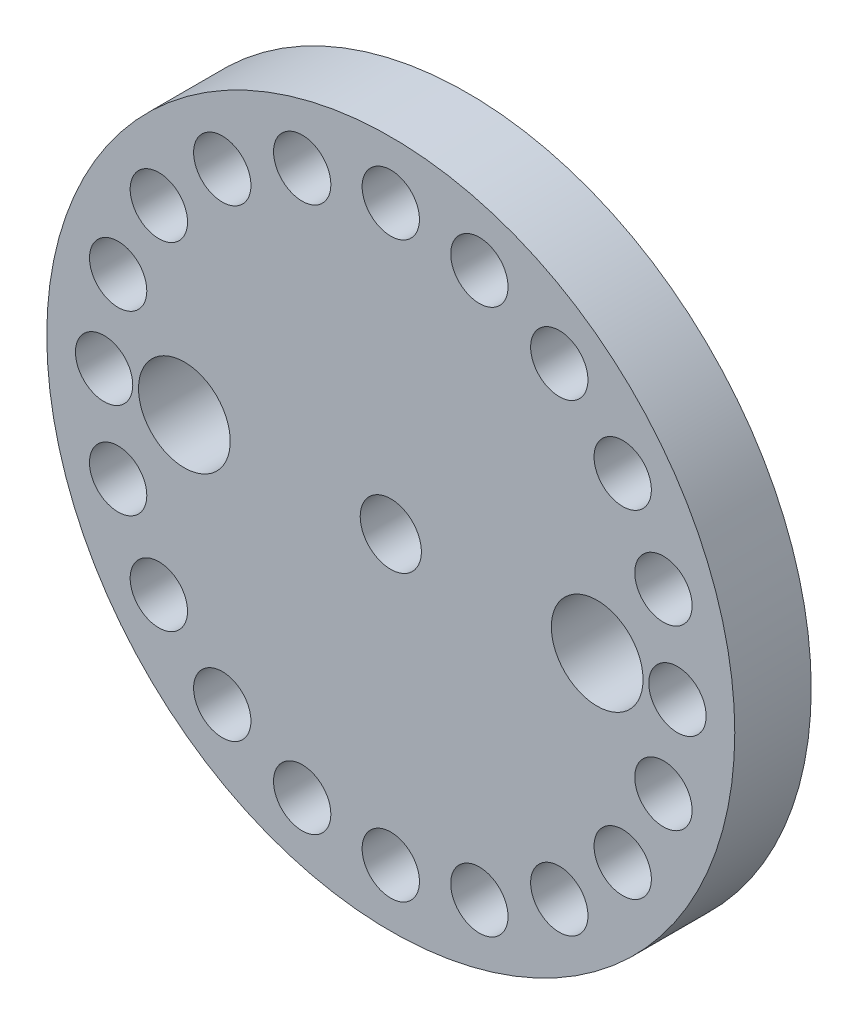
ISO-10303-21;
HEADER;
FILE_DESCRIPTION(('STEP AP214'),'2;1');
FILE_NAME('part.step','',(''),(''),'','','');
FILE_SCHEMA(('AUTOMOTIVE_DESIGN { 1 0 10303 214 1 1 1 1 }'));
ENDSEC;
DATA;
#1=APPLICATION_CONTEXT('core data for automotive mechanical design processes');
#2=APPLICATION_PROTOCOL_DEFINITION('international standard','automotive_design',2000,#1);
#3=PRODUCT_CONTEXT('',#1,'mechanical');
#4=PRODUCT('Part','Part','',(#3));
#5=PRODUCT_RELATED_PRODUCT_CATEGORY('part','',(#4));
#6=PRODUCT_DEFINITION_FORMATION('','',#4);
#7=PRODUCT_DEFINITION_CONTEXT('part definition',#1,'design');
#8=PRODUCT_DEFINITION('design','',#6,#7);
#9=PRODUCT_DEFINITION_SHAPE('','',#8);
#10=(LENGTH_UNIT() NAMED_UNIT(*) SI_UNIT(.MILLI.,.METRE.));
#11=(NAMED_UNIT(*) PLANE_ANGLE_UNIT() SI_UNIT($,.RADIAN.));
#12=(NAMED_UNIT(*) SI_UNIT($,.STERADIAN.) SOLID_ANGLE_UNIT());
#13=UNCERTAINTY_MEASURE_WITH_UNIT(LENGTH_MEASURE(1.E-05),#10,'distance_accuracy_value','');
#14=(GEOMETRIC_REPRESENTATION_CONTEXT(3) GLOBAL_UNCERTAINTY_ASSIGNED_CONTEXT((#13)) GLOBAL_UNIT_ASSIGNED_CONTEXT((#10,
#11,#12)) REPRESENTATION_CONTEXT('',''));
#15=CARTESIAN_POINT('',(0.,0.,0.));
#16=DIRECTION('',(0.,0.,1.));
#17=DIRECTION('',(1.,0.,0.));
#18=AXIS2_PLACEMENT_3D('',#15,#16,#17);
#19=CARTESIAN_POINT('',(0.,0.,10.));
#20=DIRECTION('',(0.,0.,1.));
#21=DIRECTION('',(1.,0.,0.));
#22=AXIS2_PLACEMENT_3D('',#19,#20,#21);
#23=PLANE('',#22);
#24=CARTESIAN_POINT('',(0.,0.,10.));
#25=DIRECTION('',(0.,0.,1.));
#26=DIRECTION('',(1.,0.,0.));
#27=AXIS2_PLACEMENT_3D('',#24,#25,#26);
#28=CIRCLE('',#27,4.);
#29=CARTESIAN_POINT('',(-4.,0.,10.));
#30=VERTEX_POINT('',#29);
#31=EDGE_CURVE('E173',#30,#30,#28,.T.);
#32=ORIENTED_EDGE('',*,*,#31,.F.);
#33=EDGE_LOOP('',(#32));
#34=FACE_BOUND('',#33,.T.);
#35=CARTESIAN_POINT('',(-27.,0.,10.));
#36=DIRECTION('',(0.,0.,-1.));
#37=DIRECTION('',(-1.,0.,0.));
#38=AXIS2_PLACEMENT_3D('',#35,#36,#37);
#39=CIRCLE('',#38,6.);
#40=CARTESIAN_POINT('',(-33.,0.,10.));
#41=VERTEX_POINT('',#40);
#42=EDGE_CURVE('E166',#41,#41,#39,.T.);
#43=ORIENTED_EDGE('',*,*,#42,.T.);
#44=EDGE_LOOP('',(#43));
#45=FACE_BOUND('',#44,.T.);
#46=CARTESIAN_POINT('',(27.,0.,10.));
#47=DIRECTION('',(0.,0.,-1.));
#48=DIRECTION('',(1.,0.,0.));
#49=AXIS2_PLACEMENT_3D('',#46,#47,#48);
#50=CIRCLE('',#49,6.);
#51=CARTESIAN_POINT('',(33.,0.,10.));
#52=VERTEX_POINT('',#51);
#53=EDGE_CURVE('E172',#52,#52,#50,.T.);
#54=ORIENTED_EDGE('',*,*,#53,.T.);
#55=EDGE_LOOP('',(#54));
#56=FACE_BOUND('',#55,.T.);
#57=CARTESIAN_POINT('',(-22.0419469609674,30.3381372890596,10.));
#58=DIRECTION('',(0.,0.,1.));
#59=DIRECTION('',(1.,0.,0.));
#60=AXIS2_PLACEMENT_3D('',#57,#58,#59);
#61=CIRCLE('',#60,3.75000000000104);
#62=CARTESIAN_POINT('',(-18.2919469609664,30.3381372890596,10.));
#63=VERTEX_POINT('',#62);
#64=EDGE_CURVE('E154',#63,#63,#61,.T.);
#65=ORIENTED_EDGE('',*,*,#64,.F.);
#66=EDGE_LOOP('',(#65));
#67=FACE_BOUND('',#66,.T.);
#68=CARTESIAN_POINT('',(-35.6646193610672,11.588137289059,10.));
#69=DIRECTION('',(0.,0.,1.));
#70=DIRECTION('',(1.,0.,0.));
#71=AXIS2_PLACEMENT_3D('',#68,#69,#70);
#72=CIRCLE('',#71,3.75000000000191);
#73=CARTESIAN_POINT('',(-31.9146193610653,11.588137289059,10.));
#74=VERTEX_POINT('',#73);
#75=EDGE_CURVE('E142',#74,#74,#72,.T.);
#76=ORIENTED_EDGE('',*,*,#75,.F.);
#77=EDGE_LOOP('',(#76));
#78=FACE_BOUND('',#77,.T.);
#79=CARTESIAN_POINT('',(-35.6646193610662,-11.588137289062,10.));
#80=DIRECTION('',(0.,0.,1.));
#81=DIRECTION('',(1.,0.,0.));
#82=AXIS2_PLACEMENT_3D('',#79,#80,#81);
#83=CIRCLE('',#82,3.75000000000279);
#84=CARTESIAN_POINT('',(-31.9146193610634,-11.588137289062,10.));
#85=VERTEX_POINT('',#84);
#86=EDGE_CURVE('E130',#85,#85,#83,.T.);
#87=ORIENTED_EDGE('',*,*,#86,.F.);
#88=EDGE_LOOP('',(#87));
#89=FACE_BOUND('',#88,.T.);
#90=CARTESIAN_POINT('',(-22.0419469609649,-30.3381372890615,10.));
#91=DIRECTION('',(0.,0.,1.));
#92=DIRECTION('',(1.,0.,0.));
#93=AXIS2_PLACEMENT_3D('',#90,#91,#92);
#94=CIRCLE('',#93,3.75000000000334);
#95=CARTESIAN_POINT('',(-18.2919469609615,-30.3381372890615,10.));
#96=VERTEX_POINT('',#95);
#97=EDGE_CURVE('E118',#96,#96,#94,.T.);
#98=ORIENTED_EDGE('',*,*,#97,.F.);
#99=EDGE_LOOP('',(#98));
#100=FACE_BOUND('',#99,.T.);
#101=CARTESIAN_POINT('',(3.18366503443004E-12,-37.5,10.));
#102=DIRECTION('',(0.,0.,1.));
#103=DIRECTION('',(1.,0.,0.));
#104=AXIS2_PLACEMENT_3D('',#101,#102,#103);
#105=CIRCLE('',#104,3.7500000000033);
#106=CARTESIAN_POINT('',(3.75000000000648,-37.5,10.));
#107=VERTEX_POINT('',#106);
#108=EDGE_CURVE('E106',#107,#107,#105,.T.);
#109=ORIENTED_EDGE('',*,*,#108,.F.);
#110=EDGE_LOOP('',(#109));
#111=FACE_BOUND('',#110,.T.);
#112=CARTESIAN_POINT('',(22.0419469609706,-30.3381372890596,10.));
#113=DIRECTION('',(0.,0.,1.));
#114=DIRECTION('',(1.,0.,0.));
#115=AXIS2_PLACEMENT_3D('',#112,#113,#114);
#116=CIRCLE('',#115,3.75000000000269);
#117=CARTESIAN_POINT('',(25.7919469609733,-30.3381372890596,10.));
#118=VERTEX_POINT('',#117);
#119=EDGE_CURVE('E94',#118,#118,#116,.T.);
#120=ORIENTED_EDGE('',*,*,#119,.F.);
#121=EDGE_LOOP('',(#120));
#122=FACE_BOUND('',#121,.T.);
#123=CARTESIAN_POINT('',(35.6646193610703,-11.588137289059,10.));
#124=DIRECTION('',(0.,0.,1.));
#125=DIRECTION('',(1.,0.,0.));
#126=AXIS2_PLACEMENT_3D('',#123,#124,#125);
#127=CIRCLE('',#126,3.75000000000171);
#128=CARTESIAN_POINT('',(39.414619361072,-11.588137289059,10.));
#129=VERTEX_POINT('',#128);
#130=EDGE_CURVE('E82',#129,#129,#127,.T.);
#131=ORIENTED_EDGE('',*,*,#130,.F.);
#132=EDGE_LOOP('',(#131));
#133=FACE_BOUND('',#132,.T.);
#134=CARTESIAN_POINT('',(35.6646193610694,11.588137289062,10.));
#135=DIRECTION('',(0.,0.,1.));
#136=DIRECTION('',(1.,0.,0.));
#137=AXIS2_PLACEMENT_3D('',#134,#135,#136);
#138=CIRCLE('',#137,3.75000000000072);
#139=CARTESIAN_POINT('',(39.4146193610701,11.588137289062,10.));
#140=VERTEX_POINT('',#139);
#141=EDGE_CURVE('E70',#140,#140,#138,.T.);
#142=ORIENTED_EDGE('',*,*,#141,.F.);
#143=EDGE_LOOP('',(#142));
#144=FACE_BOUND('',#143,.T.);
#145=CARTESIAN_POINT('',(22.0419469609678,30.3381372890605,10.));
#146=DIRECTION('',(0.,0.,1.));
#147=DIRECTION('',(1.,0.,0.));
#148=AXIS2_PLACEMENT_3D('',#145,#146,#147);
#149=CIRCLE('',#148,3.75);
#150=CARTESIAN_POINT('',(25.7919469609678,30.3381372890605,10.));
#151=VERTEX_POINT('',#150);
#152=EDGE_CURVE('E58',#151,#151,#149,.T.);
#153=ORIENTED_EDGE('',*,*,#152,.F.);
#154=EDGE_LOOP('',(#153));
#155=FACE_BOUND('',#154,.T.);
#156=CARTESIAN_POINT('',(0.,37.5,10.));
#157=DIRECTION('',(0.,0.,1.));
#158=DIRECTION('',(1.,0.,0.));
#159=AXIS2_PLACEMENT_3D('',#156,#157,#158);
#160=CIRCLE('',#159,3.75);
#161=CARTESIAN_POINT('',(3.75,37.5,10.));
#162=VERTEX_POINT('',#161);
#163=EDGE_CURVE('E47',#162,#162,#160,.T.);
#164=ORIENTED_EDGE('',*,*,#163,.F.);
#165=EDGE_LOOP('',(#164));
#166=FACE_BOUND('',#165,.T.);
#167=CARTESIAN_POINT('',(0.,0.,10.));
#168=DIRECTION('',(0.,0.,1.));
#169=DIRECTION('',(1.,0.,0.));
#170=AXIS2_PLACEMENT_3D('',#167,#168,#169);
#171=CIRCLE('',#170,45.);
#172=CARTESIAN_POINT('',(45.,0.,10.));
#173=VERTEX_POINT('',#172);
#174=EDGE_CURVE('E10',#173,#173,#171,.T.);
#175=ORIENTED_EDGE('',*,*,#174,.T.);
#176=EDGE_LOOP('',(#175));
#177=FACE_BOUND('',#176,.T.);
#178=CARTESIAN_POINT('',(11.5881372890606,35.6646193610683,10.));
#179=DIRECTION('',(0.,0.,1.));
#180=DIRECTION('',(1.,0.,0.));
#181=AXIS2_PLACEMENT_3D('',#178,#179,#180);
#182=CIRCLE('',#181,3.75);
#183=CARTESIAN_POINT('',(15.3381372890606,35.6646193610683,10.));
#184=VERTEX_POINT('',#183);
#185=EDGE_CURVE('E52',#184,#184,#182,.T.);
#186=ORIENTED_EDGE('',*,*,#185,.F.);
#187=EDGE_LOOP('',(#186));
#188=FACE_BOUND('',#187,.T.);
#189=CARTESIAN_POINT('',(30.3381372890612,22.041946960969,10.));
#190=DIRECTION('',(0.,0.,1.));
#191=DIRECTION('',(1.,0.,0.));
#192=AXIS2_PLACEMENT_3D('',#189,#190,#191);
#193=CIRCLE('',#192,3.75000000000033);
#194=CARTESIAN_POINT('',(34.0881372890615,22.041946960969,10.));
#195=VERTEX_POINT('',#194);
#196=EDGE_CURVE('E64',#195,#195,#193,.T.);
#197=ORIENTED_EDGE('',*,*,#196,.F.);
#198=EDGE_LOOP('',(#197));
#199=FACE_BOUND('',#198,.T.);
#200=CARTESIAN_POINT('',(37.5000000000016,1.59183251721502E-12,10.));
#201=DIRECTION('',(0.,0.,1.));
#202=DIRECTION('',(1.,0.,0.));
#203=AXIS2_PLACEMENT_3D('',#200,#201,#202);
#204=CIRCLE('',#203,3.75000000000119);
#205=CARTESIAN_POINT('',(41.2500000000028,1.59183251721502E-12,10.));
#206=VERTEX_POINT('',#205);
#207=EDGE_CURVE('E76',#206,#206,#204,.T.);
#208=ORIENTED_EDGE('',*,*,#207,.F.);
#209=EDGE_LOOP('',(#208));
#210=FACE_BOUND('',#209,.T.);
#211=CARTESIAN_POINT('',(30.3381372890631,-22.0419469609665,10.));
#212=DIRECTION('',(0.,0.,1.));
#213=DIRECTION('',(1.,0.,0.));
#214=AXIS2_PLACEMENT_3D('',#211,#212,#213);
#215=CIRCLE('',#214,3.75000000000222);
#216=CARTESIAN_POINT('',(34.0881372890653,-22.0419469609665,10.));
#217=VERTEX_POINT('',#216);
#218=EDGE_CURVE('E88',#217,#217,#215,.T.);
#219=ORIENTED_EDGE('',*,*,#218,.F.);
#220=EDGE_LOOP('',(#219));
#221=FACE_BOUND('',#220,.T.);
#222=CARTESIAN_POINT('',(11.5881372890636,-35.6646193610678,10.));
#223=DIRECTION('',(0.,0.,1.));
#224=DIRECTION('',(1.,0.,0.));
#225=AXIS2_PLACEMENT_3D('',#222,#223,#224);
#226=CIRCLE('',#225,3.75000000000307);
#227=CARTESIAN_POINT('',(15.3381372890667,-35.6646193610678,10.));
#228=VERTEX_POINT('',#227);
#229=EDGE_CURVE('E100',#228,#228,#226,.T.);
#230=ORIENTED_EDGE('',*,*,#229,.F.);
#231=EDGE_LOOP('',(#230));
#232=FACE_BOUND('',#231,.T.);
#233=CARTESIAN_POINT('',(-11.5881372890574,-35.6646193610688,10.));
#234=DIRECTION('',(0.,0.,1.));
#235=DIRECTION('',(1.,0.,0.));
#236=AXIS2_PLACEMENT_3D('',#233,#234,#235);
#237=CIRCLE('',#236,3.7500000000034);
#238=CARTESIAN_POINT('',(-7.83813728905402,-35.6646193610688,10.));
#239=VERTEX_POINT('',#238);
#240=EDGE_CURVE('E112',#239,#239,#237,.T.);
#241=ORIENTED_EDGE('',*,*,#240,.F.);
#242=EDGE_LOOP('',(#241));
#243=FACE_BOUND('',#242,.T.);
#244=CARTESIAN_POINT('',(-30.338137289058,-22.041946960969,10.));
#245=DIRECTION('',(0.,0.,1.));
#246=DIRECTION('',(1.,0.,0.));
#247=AXIS2_PLACEMENT_3D('',#244,#245,#246);
#248=CIRCLE('',#247,3.75000000000315);
#249=CARTESIAN_POINT('',(-26.5881372890549,-22.041946960969,10.));
#250=VERTEX_POINT('',#249);
#251=EDGE_CURVE('E124',#250,#250,#248,.T.);
#252=ORIENTED_EDGE('',*,*,#251,.F.);
#253=EDGE_LOOP('',(#252));
#254=FACE_BOUND('',#253,.T.);
#255=CARTESIAN_POINT('',(-37.4999999999984,-1.59642494271182E-12,10.));
#256=DIRECTION('',(0.,0.,1.));
#257=DIRECTION('',(1.,0.,0.));
#258=AXIS2_PLACEMENT_3D('',#255,#256,#257);
#259=CIRCLE('',#258,3.75000000000237);
#260=CARTESIAN_POINT('',(-33.749999999996,-1.59642494271182E-12,10.));
#261=VERTEX_POINT('',#260);
#262=EDGE_CURVE('E136',#261,#261,#259,.T.);
#263=ORIENTED_EDGE('',*,*,#262,.F.);
#264=EDGE_LOOP('',(#263));
#265=FACE_BOUND('',#264,.T.);
#266=CARTESIAN_POINT('',(-30.3381372890599,22.0419469609664,10.));
#267=DIRECTION('',(0.,0.,1.));
#268=DIRECTION('',(1.,0.,0.));
#269=AXIS2_PLACEMENT_3D('',#266,#267,#268);
#270=CIRCLE('',#269,3.75000000000145);
#271=CARTESIAN_POINT('',(-26.5881372890584,22.0419469609664,10.));
#272=VERTEX_POINT('',#271);
#273=EDGE_CURVE('E148',#272,#272,#270,.T.);
#274=ORIENTED_EDGE('',*,*,#273,.F.);
#275=EDGE_LOOP('',(#274));
#276=FACE_BOUND('',#275,.T.);
#277=CARTESIAN_POINT('',(-11.5881372890601,35.6646193610684,10.));
#278=DIRECTION('',(0.,0.,1.));
#279=DIRECTION('',(1.,0.,0.));
#280=AXIS2_PLACEMENT_3D('',#277,#278,#279);
#281=CIRCLE('',#280,3.75);
#282=CARTESIAN_POINT('',(-7.83813728906006,35.6646193610684,10.));
#283=VERTEX_POINT('',#282);
#284=EDGE_CURVE('E160',#283,#283,#281,.T.);
#285=ORIENTED_EDGE('',*,*,#284,.F.);
#286=EDGE_LOOP('',(#285));
#287=FACE_BOUND('',#286,.T.);
#288=ADVANCED_FACE('F36',(#34,#45,#56,#67,#78,#89,#100,#111,#122,#133,#144,#155,#166,#177,#188,
#199,#210,#221,#232,#243,#254,#265,#276,#287),#23,.T.);
#289=CARTESIAN_POINT('',(0.,0.,0.));
#290=DIRECTION('',(0.,0.,1.));
#291=DIRECTION('',(1.,0.,0.));
#292=AXIS2_PLACEMENT_3D('',#289,#290,#291);
#293=PLANE('',#292);
#294=CARTESIAN_POINT('',(0.,0.,0.));
#295=DIRECTION('',(0.,0.,-1.));
#296=DIRECTION('',(-1.,0.,0.));
#297=AXIS2_PLACEMENT_3D('',#294,#295,#296);
#298=CIRCLE('',#297,4.);
#299=CARTESIAN_POINT('',(-4.,0.,0.));
#300=VERTEX_POINT('',#299);
#301=EDGE_CURVE('E183',#300,#300,#298,.T.);
#302=ORIENTED_EDGE('',*,*,#301,.F.);
#303=EDGE_LOOP('',(#302));
#304=FACE_BOUND('',#303,.T.);
#305=CARTESIAN_POINT('',(-27.,0.,0.));
#306=DIRECTION('',(0.,0.,-1.));
#307=DIRECTION('',(-1.,0.,0.));
#308=AXIS2_PLACEMENT_3D('',#305,#306,#307);
#309=CIRCLE('',#308,6.);
#310=CARTESIAN_POINT('',(-33.,0.,0.));
#311=VERTEX_POINT('',#310);
#312=EDGE_CURVE('E176',#311,#311,#309,.T.);
#313=ORIENTED_EDGE('',*,*,#312,.F.);
#314=EDGE_LOOP('',(#313));
#315=FACE_BOUND('',#314,.T.);
#316=CARTESIAN_POINT('',(27.,0.,0.));
#317=DIRECTION('',(0.,0.,-1.));
#318=DIRECTION('',(1.,0.,0.));
#319=AXIS2_PLACEMENT_3D('',#316,#317,#318);
#320=CIRCLE('',#319,6.);
#321=CARTESIAN_POINT('',(33.,0.,0.));
#322=VERTEX_POINT('',#321);
#323=EDGE_CURVE('E169',#322,#322,#320,.T.);
#324=ORIENTED_EDGE('',*,*,#323,.F.);
#325=EDGE_LOOP('',(#324));
#326=FACE_BOUND('',#325,.T.);
#327=CARTESIAN_POINT('',(0.,0.,0.));
#328=DIRECTION('',(0.,0.,1.));
#329=DIRECTION('',(1.,0.,0.));
#330=AXIS2_PLACEMENT_3D('',#327,#328,#329);
#331=CIRCLE('',#330,45.);
#332=CARTESIAN_POINT('',(45.,0.,0.));
#333=VERTEX_POINT('',#332);
#334=EDGE_CURVE('E40',#333,#333,#331,.T.);
#335=ORIENTED_EDGE('',*,*,#334,.F.);
#336=EDGE_LOOP('',(#335));
#337=FACE_BOUND('',#336,.T.);
#338=CARTESIAN_POINT('',(0.,37.5,0.));
#339=DIRECTION('',(0.,0.,1.));
#340=DIRECTION('',(1.,0.,0.));
#341=AXIS2_PLACEMENT_3D('',#338,#339,#340);
#342=CIRCLE('',#341,3.75);
#343=CARTESIAN_POINT('',(3.75,37.5,0.));
#344=VERTEX_POINT('',#343);
#345=EDGE_CURVE('E49',#344,#344,#342,.T.);
#346=ORIENTED_EDGE('',*,*,#345,.T.);
#347=EDGE_LOOP('',(#346));
#348=FACE_BOUND('',#347,.T.);
#349=CARTESIAN_POINT('',(11.5881372890606,35.6646193610683,0.));
#350=DIRECTION('',(0.,0.,1.));
#351=DIRECTION('',(1.,0.,0.));
#352=AXIS2_PLACEMENT_3D('',#349,#350,#351);
#353=CIRCLE('',#352,3.75);
#354=CARTESIAN_POINT('',(15.3381372890606,35.6646193610683,0.));
#355=VERTEX_POINT('',#354);
#356=EDGE_CURVE('E55',#355,#355,#353,.T.);
#357=ORIENTED_EDGE('',*,*,#356,.T.);
#358=EDGE_LOOP('',(#357));
#359=FACE_BOUND('',#358,.T.);
#360=CARTESIAN_POINT('',(22.0419469609678,30.3381372890605,0.));
#361=DIRECTION('',(0.,0.,1.));
#362=DIRECTION('',(1.,0.,0.));
#363=AXIS2_PLACEMENT_3D('',#360,#361,#362);
#364=CIRCLE('',#363,3.75);
#365=CARTESIAN_POINT('',(25.7919469609678,30.3381372890605,0.));
#366=VERTEX_POINT('',#365);
#367=EDGE_CURVE('E61',#366,#366,#364,.T.);
#368=ORIENTED_EDGE('',*,*,#367,.T.);
#369=EDGE_LOOP('',(#368));
#370=FACE_BOUND('',#369,.T.);
#371=CARTESIAN_POINT('',(30.3381372890612,22.041946960969,0.));
#372=DIRECTION('',(0.,0.,1.));
#373=DIRECTION('',(1.,0.,0.));
#374=AXIS2_PLACEMENT_3D('',#371,#372,#373);
#375=CIRCLE('',#374,3.75000000000033);
#376=CARTESIAN_POINT('',(34.0881372890615,22.041946960969,0.));
#377=VERTEX_POINT('',#376);
#378=EDGE_CURVE('E67',#377,#377,#375,.T.);
#379=ORIENTED_EDGE('',*,*,#378,.T.);
#380=EDGE_LOOP('',(#379));
#381=FACE_BOUND('',#380,.T.);
#382=CARTESIAN_POINT('',(35.6646193610694,11.588137289062,0.));
#383=DIRECTION('',(0.,0.,1.));
#384=DIRECTION('',(1.,0.,0.));
#385=AXIS2_PLACEMENT_3D('',#382,#383,#384);
#386=CIRCLE('',#385,3.75000000000072);
#387=CARTESIAN_POINT('',(39.4146193610701,11.588137289062,0.));
#388=VERTEX_POINT('',#387);
#389=EDGE_CURVE('E73',#388,#388,#386,.T.);
#390=ORIENTED_EDGE('',*,*,#389,.T.);
#391=EDGE_LOOP('',(#390));
#392=FACE_BOUND('',#391,.T.);
#393=CARTESIAN_POINT('',(37.5000000000016,1.59183251721502E-12,0.));
#394=DIRECTION('',(0.,0.,1.));
#395=DIRECTION('',(1.,0.,0.));
#396=AXIS2_PLACEMENT_3D('',#393,#394,#395);
#397=CIRCLE('',#396,3.75000000000119);
#398=CARTESIAN_POINT('',(41.2500000000028,1.59183251721502E-12,0.));
#399=VERTEX_POINT('',#398);
#400=EDGE_CURVE('E79',#399,#399,#397,.T.);
#401=ORIENTED_EDGE('',*,*,#400,.T.);
#402=EDGE_LOOP('',(#401));
#403=FACE_BOUND('',#402,.T.);
#404=CARTESIAN_POINT('',(35.6646193610703,-11.588137289059,0.));
#405=DIRECTION('',(0.,0.,1.));
#406=DIRECTION('',(1.,0.,0.));
#407=AXIS2_PLACEMENT_3D('',#404,#405,#406);
#408=CIRCLE('',#407,3.75000000000171);
#409=CARTESIAN_POINT('',(39.414619361072,-11.588137289059,0.));
#410=VERTEX_POINT('',#409);
#411=EDGE_CURVE('E85',#410,#410,#408,.T.);
#412=ORIENTED_EDGE('',*,*,#411,.T.);
#413=EDGE_LOOP('',(#412));
#414=FACE_BOUND('',#413,.T.);
#415=CARTESIAN_POINT('',(30.3381372890631,-22.0419469609665,0.));
#416=DIRECTION('',(0.,0.,1.));
#417=DIRECTION('',(1.,0.,0.));
#418=AXIS2_PLACEMENT_3D('',#415,#416,#417);
#419=CIRCLE('',#418,3.75000000000222);
#420=CARTESIAN_POINT('',(34.0881372890653,-22.0419469609665,0.));
#421=VERTEX_POINT('',#420);
#422=EDGE_CURVE('E91',#421,#421,#419,.T.);
#423=ORIENTED_EDGE('',*,*,#422,.T.);
#424=EDGE_LOOP('',(#423));
#425=FACE_BOUND('',#424,.T.);
#426=CARTESIAN_POINT('',(22.0419469609706,-30.3381372890596,0.));
#427=DIRECTION('',(0.,0.,1.));
#428=DIRECTION('',(1.,0.,0.));
#429=AXIS2_PLACEMENT_3D('',#426,#427,#428);
#430=CIRCLE('',#429,3.75000000000269);
#431=CARTESIAN_POINT('',(25.7919469609733,-30.3381372890596,0.));
#432=VERTEX_POINT('',#431);
#433=EDGE_CURVE('E97',#432,#432,#430,.T.);
#434=ORIENTED_EDGE('',*,*,#433,.T.);
#435=EDGE_LOOP('',(#434));
#436=FACE_BOUND('',#435,.T.);
#437=CARTESIAN_POINT('',(11.5881372890636,-35.6646193610678,0.));
#438=DIRECTION('',(0.,0.,1.));
#439=DIRECTION('',(1.,0.,0.));
#440=AXIS2_PLACEMENT_3D('',#437,#438,#439);
#441=CIRCLE('',#440,3.75000000000307);
#442=CARTESIAN_POINT('',(15.3381372890667,-35.6646193610678,0.));
#443=VERTEX_POINT('',#442);
#444=EDGE_CURVE('E103',#443,#443,#441,.T.);
#445=ORIENTED_EDGE('',*,*,#444,.T.);
#446=EDGE_LOOP('',(#445));
#447=FACE_BOUND('',#446,.T.);
#448=CARTESIAN_POINT('',(3.18366503443004E-12,-37.5,0.));
#449=DIRECTION('',(0.,0.,1.));
#450=DIRECTION('',(1.,0.,0.));
#451=AXIS2_PLACEMENT_3D('',#448,#449,#450);
#452=CIRCLE('',#451,3.7500000000033);
#453=CARTESIAN_POINT('',(3.75000000000648,-37.5,0.));
#454=VERTEX_POINT('',#453);
#455=EDGE_CURVE('E109',#454,#454,#452,.T.);
#456=ORIENTED_EDGE('',*,*,#455,.T.);
#457=EDGE_LOOP('',(#456));
#458=FACE_BOUND('',#457,.T.);
#459=CARTESIAN_POINT('',(-11.5881372890574,-35.6646193610688,0.));
#460=DIRECTION('',(0.,0.,1.));
#461=DIRECTION('',(1.,0.,0.));
#462=AXIS2_PLACEMENT_3D('',#459,#460,#461);
#463=CIRCLE('',#462,3.7500000000034);
#464=CARTESIAN_POINT('',(-7.83813728905402,-35.6646193610688,0.));
#465=VERTEX_POINT('',#464);
#466=EDGE_CURVE('E115',#465,#465,#463,.T.);
#467=ORIENTED_EDGE('',*,*,#466,.T.);
#468=EDGE_LOOP('',(#467));
#469=FACE_BOUND('',#468,.T.);
#470=CARTESIAN_POINT('',(-22.0419469609649,-30.3381372890615,0.));
#471=DIRECTION('',(0.,0.,1.));
#472=DIRECTION('',(1.,0.,0.));
#473=AXIS2_PLACEMENT_3D('',#470,#471,#472);
#474=CIRCLE('',#473,3.75000000000334);
#475=CARTESIAN_POINT('',(-18.2919469609615,-30.3381372890615,0.));
#476=VERTEX_POINT('',#475);
#477=EDGE_CURVE('E121',#476,#476,#474,.T.);
#478=ORIENTED_EDGE('',*,*,#477,.T.);
#479=EDGE_LOOP('',(#478));
#480=FACE_BOUND('',#479,.T.);
#481=CARTESIAN_POINT('',(-30.338137289058,-22.041946960969,0.));
#482=DIRECTION('',(0.,0.,1.));
#483=DIRECTION('',(1.,0.,0.));
#484=AXIS2_PLACEMENT_3D('',#481,#482,#483);
#485=CIRCLE('',#484,3.75000000000315);
#486=CARTESIAN_POINT('',(-26.5881372890549,-22.041946960969,0.));
#487=VERTEX_POINT('',#486);
#488=EDGE_CURVE('E127',#487,#487,#485,.T.);
#489=ORIENTED_EDGE('',*,*,#488,.T.);
#490=EDGE_LOOP('',(#489));
#491=FACE_BOUND('',#490,.T.);
#492=CARTESIAN_POINT('',(-35.6646193610662,-11.588137289062,0.));
#493=DIRECTION('',(0.,0.,1.));
#494=DIRECTION('',(1.,0.,0.));
#495=AXIS2_PLACEMENT_3D('',#492,#493,#494);
#496=CIRCLE('',#495,3.75000000000279);
#497=CARTESIAN_POINT('',(-31.9146193610634,-11.588137289062,0.));
#498=VERTEX_POINT('',#497);
#499=EDGE_CURVE('E133',#498,#498,#496,.T.);
#500=ORIENTED_EDGE('',*,*,#499,.T.);
#501=EDGE_LOOP('',(#500));
#502=FACE_BOUND('',#501,.T.);
#503=CARTESIAN_POINT('',(-37.4999999999984,-1.59642494271182E-12,0.));
#504=DIRECTION('',(0.,0.,1.));
#505=DIRECTION('',(1.,0.,0.));
#506=AXIS2_PLACEMENT_3D('',#503,#504,#505);
#507=CIRCLE('',#506,3.75000000000237);
#508=CARTESIAN_POINT('',(-33.749999999996,-1.59642494271182E-12,0.));
#509=VERTEX_POINT('',#508);
#510=EDGE_CURVE('E139',#509,#509,#507,.T.);
#511=ORIENTED_EDGE('',*,*,#510,.T.);
#512=EDGE_LOOP('',(#511));
#513=FACE_BOUND('',#512,.T.);
#514=CARTESIAN_POINT('',(-35.6646193610672,11.588137289059,0.));
#515=DIRECTION('',(0.,0.,1.));
#516=DIRECTION('',(1.,0.,0.));
#517=AXIS2_PLACEMENT_3D('',#514,#515,#516);
#518=CIRCLE('',#517,3.75000000000191);
#519=CARTESIAN_POINT('',(-31.9146193610653,11.588137289059,0.));
#520=VERTEX_POINT('',#519);
#521=EDGE_CURVE('E145',#520,#520,#518,.T.);
#522=ORIENTED_EDGE('',*,*,#521,.T.);
#523=EDGE_LOOP('',(#522));
#524=FACE_BOUND('',#523,.T.);
#525=CARTESIAN_POINT('',(-30.3381372890599,22.0419469609664,0.));
#526=DIRECTION('',(0.,0.,1.));
#527=DIRECTION('',(1.,0.,0.));
#528=AXIS2_PLACEMENT_3D('',#525,#526,#527);
#529=CIRCLE('',#528,3.75000000000145);
#530=CARTESIAN_POINT('',(-26.5881372890584,22.0419469609664,0.));
#531=VERTEX_POINT('',#530);
#532=EDGE_CURVE('E151',#531,#531,#529,.T.);
#533=ORIENTED_EDGE('',*,*,#532,.T.);
#534=EDGE_LOOP('',(#533));
#535=FACE_BOUND('',#534,.T.);
#536=CARTESIAN_POINT('',(-22.0419469609674,30.3381372890596,0.));
#537=DIRECTION('',(0.,0.,1.));
#538=DIRECTION('',(1.,0.,0.));
#539=AXIS2_PLACEMENT_3D('',#536,#537,#538);
#540=CIRCLE('',#539,3.75000000000104);
#541=CARTESIAN_POINT('',(-18.2919469609664,30.3381372890596,0.));
#542=VERTEX_POINT('',#541);
#543=EDGE_CURVE('E157',#542,#542,#540,.T.);
#544=ORIENTED_EDGE('',*,*,#543,.T.);
#545=EDGE_LOOP('',(#544));
#546=FACE_BOUND('',#545,.T.);
#547=CARTESIAN_POINT('',(-11.5881372890601,35.6646193610684,0.));
#548=DIRECTION('',(0.,0.,1.));
#549=DIRECTION('',(1.,0.,0.));
#550=AXIS2_PLACEMENT_3D('',#547,#548,#549);
#551=CIRCLE('',#550,3.75);
#552=CARTESIAN_POINT('',(-7.83813728906006,35.6646193610684,0.));
#553=VERTEX_POINT('',#552);
#554=EDGE_CURVE('E163',#553,#553,#551,.T.);
#555=ORIENTED_EDGE('',*,*,#554,.T.);
#556=EDGE_LOOP('',(#555));
#557=FACE_BOUND('',#556,.T.);
#558=ADVANCED_FACE('F189',(#304,#315,#326,#337,#348,#359,#370,#381,#392,#403,#414,#425,#436,
#447,#458,#469,#480,#491,#502,#513,#524,#535,#546,#557),#293,.F.);
#559=CARTESIAN_POINT('',(0.,0.,10.));
#560=DIRECTION('',(0.,0.,-1.));
#561=DIRECTION('',(-1.,0.,0.));
#562=AXIS2_PLACEMENT_3D('',#559,#560,#561);
#563=CYLINDRICAL_SURFACE('',#562,45.);
#564=ORIENTED_EDGE('',*,*,#174,.F.);
#565=EDGE_LOOP('',(#564));
#566=FACE_BOUND('',#565,.T.);
#567=ORIENTED_EDGE('',*,*,#334,.T.);
#568=EDGE_LOOP('',(#567));
#569=FACE_BOUND('',#568,.T.);
#570=ADVANCED_FACE('F38',(#566,#569),#563,.T.);
#571=CARTESIAN_POINT('',(0.,37.5,10.));
#572=DIRECTION('',(0.,0.,-1.));
#573=DIRECTION('',(-1.,0.,0.));
#574=AXIS2_PLACEMENT_3D('',#571,#572,#573);
#575=CYLINDRICAL_SURFACE('',#574,3.75);
#576=ORIENTED_EDGE('',*,*,#163,.T.);
#577=EDGE_LOOP('',(#576));
#578=FACE_BOUND('',#577,.T.);
#579=ORIENTED_EDGE('',*,*,#345,.F.);
#580=EDGE_LOOP('',(#579));
#581=FACE_BOUND('',#580,.T.);
#582=ADVANCED_FACE('F263',(#578,#581),#575,.F.);
#583=CARTESIAN_POINT('',(11.5881372890606,35.6646193610683,10.));
#584=DIRECTION('',(0.,0.,-1.));
#585=DIRECTION('',(-1.,0.,0.));
#586=AXIS2_PLACEMENT_3D('',#583,#584,#585);
#587=CYLINDRICAL_SURFACE('',#586,3.75);
#588=ORIENTED_EDGE('',*,*,#185,.T.);
#589=EDGE_LOOP('',(#588));
#590=FACE_BOUND('',#589,.T.);
#591=ORIENTED_EDGE('',*,*,#356,.F.);
#592=EDGE_LOOP('',(#591));
#593=FACE_BOUND('',#592,.T.);
#594=ADVANCED_FACE('F266',(#590,#593),#587,.F.);
#595=CARTESIAN_POINT('',(22.0419469609678,30.3381372890605,10.));
#596=DIRECTION('',(0.,0.,-1.));
#597=DIRECTION('',(-1.,0.,0.));
#598=AXIS2_PLACEMENT_3D('',#595,#596,#597);
#599=CYLINDRICAL_SURFACE('',#598,3.75);
#600=ORIENTED_EDGE('',*,*,#152,.T.);
#601=EDGE_LOOP('',(#600));
#602=FACE_BOUND('',#601,.T.);
#603=ORIENTED_EDGE('',*,*,#367,.F.);
#604=EDGE_LOOP('',(#603));
#605=FACE_BOUND('',#604,.T.);
#606=ADVANCED_FACE('F270',(#602,#605),#599,.F.);
#607=CARTESIAN_POINT('',(30.3381372890612,22.041946960969,10.));
#608=DIRECTION('',(0.,0.,-1.));
#609=DIRECTION('',(-1.,0.,0.));
#610=AXIS2_PLACEMENT_3D('',#607,#608,#609);
#611=CYLINDRICAL_SURFACE('',#610,3.75000000000033);
#612=ORIENTED_EDGE('',*,*,#196,.T.);
#613=EDGE_LOOP('',(#612));
#614=FACE_BOUND('',#613,.T.);
#615=ORIENTED_EDGE('',*,*,#378,.F.);
#616=EDGE_LOOP('',(#615));
#617=FACE_BOUND('',#616,.T.);
#618=ADVANCED_FACE('F274',(#614,#617),#611,.F.);
#619=CARTESIAN_POINT('',(35.6646193610694,11.588137289062,10.));
#620=DIRECTION('',(0.,0.,-1.));
#621=DIRECTION('',(-1.,0.,0.));
#622=AXIS2_PLACEMENT_3D('',#619,#620,#621);
#623=CYLINDRICAL_SURFACE('',#622,3.75000000000072);
#624=ORIENTED_EDGE('',*,*,#141,.T.);
#625=EDGE_LOOP('',(#624));
#626=FACE_BOUND('',#625,.T.);
#627=ORIENTED_EDGE('',*,*,#389,.F.);
#628=EDGE_LOOP('',(#627));
#629=FACE_BOUND('',#628,.T.);
#630=ADVANCED_FACE('F278',(#626,#629),#623,.F.);
#631=CARTESIAN_POINT('',(37.5000000000016,1.59183251721502E-12,10.));
#632=DIRECTION('',(0.,0.,-1.));
#633=DIRECTION('',(-1.,0.,0.));
#634=AXIS2_PLACEMENT_3D('',#631,#632,#633);
#635=CYLINDRICAL_SURFACE('',#634,3.75000000000119);
#636=ORIENTED_EDGE('',*,*,#207,.T.);
#637=EDGE_LOOP('',(#636));
#638=FACE_BOUND('',#637,.T.);
#639=ORIENTED_EDGE('',*,*,#400,.F.);
#640=EDGE_LOOP('',(#639));
#641=FACE_BOUND('',#640,.T.);
#642=ADVANCED_FACE('F282',(#638,#641),#635,.F.);
#643=CARTESIAN_POINT('',(35.6646193610703,-11.588137289059,10.));
#644=DIRECTION('',(0.,0.,-1.));
#645=DIRECTION('',(-1.,0.,0.));
#646=AXIS2_PLACEMENT_3D('',#643,#644,#645);
#647=CYLINDRICAL_SURFACE('',#646,3.75000000000171);
#648=ORIENTED_EDGE('',*,*,#130,.T.);
#649=EDGE_LOOP('',(#648));
#650=FACE_BOUND('',#649,.T.);
#651=ORIENTED_EDGE('',*,*,#411,.F.);
#652=EDGE_LOOP('',(#651));
#653=FACE_BOUND('',#652,.T.);
#654=ADVANCED_FACE('F286',(#650,#653),#647,.F.);
#655=CARTESIAN_POINT('',(30.3381372890631,-22.0419469609665,10.));
#656=DIRECTION('',(0.,0.,-1.));
#657=DIRECTION('',(-1.,0.,0.));
#658=AXIS2_PLACEMENT_3D('',#655,#656,#657);
#659=CYLINDRICAL_SURFACE('',#658,3.75000000000222);
#660=ORIENTED_EDGE('',*,*,#218,.T.);
#661=EDGE_LOOP('',(#660));
#662=FACE_BOUND('',#661,.T.);
#663=ORIENTED_EDGE('',*,*,#422,.F.);
#664=EDGE_LOOP('',(#663));
#665=FACE_BOUND('',#664,.T.);
#666=ADVANCED_FACE('F290',(#662,#665),#659,.F.);
#667=CARTESIAN_POINT('',(22.0419469609706,-30.3381372890596,10.));
#668=DIRECTION('',(0.,0.,-1.));
#669=DIRECTION('',(-1.,0.,0.));
#670=AXIS2_PLACEMENT_3D('',#667,#668,#669);
#671=CYLINDRICAL_SURFACE('',#670,3.75000000000269);
#672=ORIENTED_EDGE('',*,*,#119,.T.);
#673=EDGE_LOOP('',(#672));
#674=FACE_BOUND('',#673,.T.);
#675=ORIENTED_EDGE('',*,*,#433,.F.);
#676=EDGE_LOOP('',(#675));
#677=FACE_BOUND('',#676,.T.);
#678=ADVANCED_FACE('F294',(#674,#677),#671,.F.);
#679=CARTESIAN_POINT('',(11.5881372890636,-35.6646193610678,10.));
#680=DIRECTION('',(0.,0.,-1.));
#681=DIRECTION('',(-1.,0.,0.));
#682=AXIS2_PLACEMENT_3D('',#679,#680,#681);
#683=CYLINDRICAL_SURFACE('',#682,3.75000000000307);
#684=ORIENTED_EDGE('',*,*,#229,.T.);
#685=EDGE_LOOP('',(#684));
#686=FACE_BOUND('',#685,.T.);
#687=ORIENTED_EDGE('',*,*,#444,.F.);
#688=EDGE_LOOP('',(#687));
#689=FACE_BOUND('',#688,.T.);
#690=ADVANCED_FACE('F298',(#686,#689),#683,.F.);
#691=CARTESIAN_POINT('',(3.18366503443004E-12,-37.5,10.));
#692=DIRECTION('',(0.,0.,-1.));
#693=DIRECTION('',(-1.,0.,0.));
#694=AXIS2_PLACEMENT_3D('',#691,#692,#693);
#695=CYLINDRICAL_SURFACE('',#694,3.7500000000033);
#696=ORIENTED_EDGE('',*,*,#108,.T.);
#697=EDGE_LOOP('',(#696));
#698=FACE_BOUND('',#697,.T.);
#699=ORIENTED_EDGE('',*,*,#455,.F.);
#700=EDGE_LOOP('',(#699));
#701=FACE_BOUND('',#700,.T.);
#702=ADVANCED_FACE('F302',(#698,#701),#695,.F.);
#703=CARTESIAN_POINT('',(-11.5881372890574,-35.6646193610688,10.));
#704=DIRECTION('',(0.,0.,-1.));
#705=DIRECTION('',(-1.,0.,0.));
#706=AXIS2_PLACEMENT_3D('',#703,#704,#705);
#707=CYLINDRICAL_SURFACE('',#706,3.7500000000034);
#708=ORIENTED_EDGE('',*,*,#240,.T.);
#709=EDGE_LOOP('',(#708));
#710=FACE_BOUND('',#709,.T.);
#711=ORIENTED_EDGE('',*,*,#466,.F.);
#712=EDGE_LOOP('',(#711));
#713=FACE_BOUND('',#712,.T.);
#714=ADVANCED_FACE('F306',(#710,#713),#707,.F.);
#715=CARTESIAN_POINT('',(-22.0419469609649,-30.3381372890615,10.));
#716=DIRECTION('',(0.,0.,-1.));
#717=DIRECTION('',(-1.,0.,0.));
#718=AXIS2_PLACEMENT_3D('',#715,#716,#717);
#719=CYLINDRICAL_SURFACE('',#718,3.75000000000334);
#720=ORIENTED_EDGE('',*,*,#97,.T.);
#721=EDGE_LOOP('',(#720));
#722=FACE_BOUND('',#721,.T.);
#723=ORIENTED_EDGE('',*,*,#477,.F.);
#724=EDGE_LOOP('',(#723));
#725=FACE_BOUND('',#724,.T.);
#726=ADVANCED_FACE('F310',(#722,#725),#719,.F.);
#727=CARTESIAN_POINT('',(-30.338137289058,-22.041946960969,10.));
#728=DIRECTION('',(0.,0.,-1.));
#729=DIRECTION('',(-1.,0.,0.));
#730=AXIS2_PLACEMENT_3D('',#727,#728,#729);
#731=CYLINDRICAL_SURFACE('',#730,3.75000000000315);
#732=ORIENTED_EDGE('',*,*,#251,.T.);
#733=EDGE_LOOP('',(#732));
#734=FACE_BOUND('',#733,.T.);
#735=ORIENTED_EDGE('',*,*,#488,.F.);
#736=EDGE_LOOP('',(#735));
#737=FACE_BOUND('',#736,.T.);
#738=ADVANCED_FACE('F314',(#734,#737),#731,.F.);
#739=CARTESIAN_POINT('',(-35.6646193610662,-11.588137289062,10.));
#740=DIRECTION('',(0.,0.,-1.));
#741=DIRECTION('',(-1.,0.,0.));
#742=AXIS2_PLACEMENT_3D('',#739,#740,#741);
#743=CYLINDRICAL_SURFACE('',#742,3.75000000000279);
#744=ORIENTED_EDGE('',*,*,#86,.T.);
#745=EDGE_LOOP('',(#744));
#746=FACE_BOUND('',#745,.T.);
#747=ORIENTED_EDGE('',*,*,#499,.F.);
#748=EDGE_LOOP('',(#747));
#749=FACE_BOUND('',#748,.T.);
#750=ADVANCED_FACE('F318',(#746,#749),#743,.F.);
#751=CARTESIAN_POINT('',(-37.4999999999984,-1.59642494271182E-12,10.));
#752=DIRECTION('',(0.,0.,-1.));
#753=DIRECTION('',(-1.,0.,0.));
#754=AXIS2_PLACEMENT_3D('',#751,#752,#753);
#755=CYLINDRICAL_SURFACE('',#754,3.75000000000237);
#756=ORIENTED_EDGE('',*,*,#262,.T.);
#757=EDGE_LOOP('',(#756));
#758=FACE_BOUND('',#757,.T.);
#759=ORIENTED_EDGE('',*,*,#510,.F.);
#760=EDGE_LOOP('',(#759));
#761=FACE_BOUND('',#760,.T.);
#762=ADVANCED_FACE('F322',(#758,#761),#755,.F.);
#763=CARTESIAN_POINT('',(-35.6646193610672,11.588137289059,10.));
#764=DIRECTION('',(0.,0.,-1.));
#765=DIRECTION('',(-1.,0.,0.));
#766=AXIS2_PLACEMENT_3D('',#763,#764,#765);
#767=CYLINDRICAL_SURFACE('',#766,3.75000000000191);
#768=ORIENTED_EDGE('',*,*,#75,.T.);
#769=EDGE_LOOP('',(#768));
#770=FACE_BOUND('',#769,.T.);
#771=ORIENTED_EDGE('',*,*,#521,.F.);
#772=EDGE_LOOP('',(#771));
#773=FACE_BOUND('',#772,.T.);
#774=ADVANCED_FACE('F326',(#770,#773),#767,.F.);
#775=CARTESIAN_POINT('',(-30.3381372890599,22.0419469609664,10.));
#776=DIRECTION('',(0.,0.,-1.));
#777=DIRECTION('',(-1.,0.,0.));
#778=AXIS2_PLACEMENT_3D('',#775,#776,#777);
#779=CYLINDRICAL_SURFACE('',#778,3.75000000000145);
#780=ORIENTED_EDGE('',*,*,#273,.T.);
#781=EDGE_LOOP('',(#780));
#782=FACE_BOUND('',#781,.T.);
#783=ORIENTED_EDGE('',*,*,#532,.F.);
#784=EDGE_LOOP('',(#783));
#785=FACE_BOUND('',#784,.T.);
#786=ADVANCED_FACE('F251',(#782,#785),#779,.F.);
#787=CARTESIAN_POINT('',(-22.0419469609674,30.3381372890596,10.));
#788=DIRECTION('',(0.,0.,-1.));
#789=DIRECTION('',(-1.,0.,0.));
#790=AXIS2_PLACEMENT_3D('',#787,#788,#789);
#791=CYLINDRICAL_SURFACE('',#790,3.75000000000104);
#792=ORIENTED_EDGE('',*,*,#64,.T.);
#793=EDGE_LOOP('',(#792));
#794=FACE_BOUND('',#793,.T.);
#795=ORIENTED_EDGE('',*,*,#543,.F.);
#796=EDGE_LOOP('',(#795));
#797=FACE_BOUND('',#796,.T.);
#798=ADVANCED_FACE('F241',(#794,#797),#791,.F.);
#799=CARTESIAN_POINT('',(-11.5881372890601,35.6646193610684,10.));
#800=DIRECTION('',(0.,0.,-1.));
#801=DIRECTION('',(-1.,0.,0.));
#802=AXIS2_PLACEMENT_3D('',#799,#800,#801);
#803=CYLINDRICAL_SURFACE('',#802,3.75);
#804=ORIENTED_EDGE('',*,*,#284,.T.);
#805=EDGE_LOOP('',(#804));
#806=FACE_BOUND('',#805,.T.);
#807=ORIENTED_EDGE('',*,*,#554,.F.);
#808=EDGE_LOOP('',(#807));
#809=FACE_BOUND('',#808,.T.);
#810=ADVANCED_FACE('F238',(#806,#809),#803,.F.);
#811=CARTESIAN_POINT('',(27.,0.,10.));
#812=DIRECTION('',(0.,0.,-1.));
#813=DIRECTION('',(-1.,0.,0.));
#814=AXIS2_PLACEMENT_3D('',#811,#812,#813);
#815=CYLINDRICAL_SURFACE('',#814,6.);
#816=ORIENTED_EDGE('',*,*,#53,.F.);
#817=EDGE_LOOP('',(#816));
#818=FACE_BOUND('',#817,.T.);
#819=ORIENTED_EDGE('',*,*,#323,.T.);
#820=EDGE_LOOP('',(#819));
#821=FACE_BOUND('',#820,.T.);
#822=ADVANCED_FACE('F240',(#818,#821),#815,.F.);
#823=CARTESIAN_POINT('',(-27.,0.,10.));
#824=DIRECTION('',(0.,0.,-1.));
#825=DIRECTION('',(-1.,0.,0.));
#826=AXIS2_PLACEMENT_3D('',#823,#824,#825);
#827=CYLINDRICAL_SURFACE('',#826,6.);
#828=ORIENTED_EDGE('',*,*,#42,.F.);
#829=EDGE_LOOP('',(#828));
#830=FACE_BOUND('',#829,.T.);
#831=ORIENTED_EDGE('',*,*,#312,.T.);
#832=EDGE_LOOP('',(#831));
#833=FACE_BOUND('',#832,.T.);
#834=ADVANCED_FACE('F248',(#830,#833),#827,.F.);
#835=CARTESIAN_POINT('',(0.,0.,13.));
#836=DIRECTION('',(0.,0.,-1.));
#837=DIRECTION('',(-1.,0.,0.));
#838=AXIS2_PLACEMENT_3D('',#835,#836,#837);
#839=CYLINDRICAL_SURFACE('',#838,4.);
#840=CARTESIAN_POINT('',(-4.,0.,10.));
#841=CARTESIAN_POINT('',(-4.,0.,9.89583333333333));
#842=CARTESIAN_POINT('',(-4.,0.,9.79166666666667));
#843=CARTESIAN_POINT('',(-4.,0.,9.58333333333333));
#844=CARTESIAN_POINT('',(-4.,0.,9.47916666666667));
#845=CARTESIAN_POINT('',(-4.,0.,9.27083333333333));
#846=CARTESIAN_POINT('',(-4.,0.,9.16666666666667));
#847=CARTESIAN_POINT('',(-4.,0.,8.95833333333333));
#848=CARTESIAN_POINT('',(-4.,0.,8.85416666666667));
#849=CARTESIAN_POINT('',(-4.,0.,8.64583333333333));
#850=CARTESIAN_POINT('',(-4.,0.,8.54166666666667));
#851=CARTESIAN_POINT('',(-4.,0.,8.33333333333333));
#852=CARTESIAN_POINT('',(-4.,0.,8.22916666666667));
#853=CARTESIAN_POINT('',(-4.,0.,8.02083333333333));
#854=CARTESIAN_POINT('',(-4.,0.,7.91666666666667));
#855=CARTESIAN_POINT('',(-4.,0.,7.70833333333333));
#856=CARTESIAN_POINT('',(-4.,0.,7.60416666666667));
#857=CARTESIAN_POINT('',(-4.,0.,7.39583333333333));
#858=CARTESIAN_POINT('',(-4.,0.,7.29166666666667));
#859=CARTESIAN_POINT('',(-4.,0.,7.08333333333333));
#860=CARTESIAN_POINT('',(-4.,0.,6.97916666666667));
#861=CARTESIAN_POINT('',(-4.,0.,6.77083333333333));
#862=CARTESIAN_POINT('',(-4.,0.,6.66666666666667));
#863=CARTESIAN_POINT('',(-4.,0.,6.45833333333333));
#864=CARTESIAN_POINT('',(-4.,0.,6.35416666666667));
#865=CARTESIAN_POINT('',(-4.,0.,6.14583333333333));
#866=CARTESIAN_POINT('',(-4.,0.,6.04166666666667));
#867=CARTESIAN_POINT('',(-4.,0.,5.83333333333333));
#868=CARTESIAN_POINT('',(-4.,0.,5.72916666666667));
#869=CARTESIAN_POINT('',(-4.,0.,5.52083333333333));
#870=CARTESIAN_POINT('',(-4.,0.,5.41666666666667));
#871=CARTESIAN_POINT('',(-4.,0.,5.20833333333333));
#872=CARTESIAN_POINT('',(-4.,0.,5.10416666666667));
#873=CARTESIAN_POINT('',(-4.,0.,4.89583333333333));
#874=CARTESIAN_POINT('',(-4.,0.,4.79166666666667));
#875=CARTESIAN_POINT('',(-4.,0.,4.58333333333333));
#876=CARTESIAN_POINT('',(-4.,0.,4.47916666666667));
#877=CARTESIAN_POINT('',(-4.,0.,4.27083333333333));
#878=CARTESIAN_POINT('',(-4.,0.,4.16666666666667));
#879=CARTESIAN_POINT('',(-4.,0.,3.95833333333333));
#880=CARTESIAN_POINT('',(-4.,0.,3.85416666666667));
#881=CARTESIAN_POINT('',(-4.,0.,3.64583333333333));
#882=CARTESIAN_POINT('',(-4.,0.,3.54166666666667));
#883=CARTESIAN_POINT('',(-4.,0.,3.33333333333333));
#884=CARTESIAN_POINT('',(-4.,0.,3.22916666666667));
#885=CARTESIAN_POINT('',(-4.,0.,3.02083333333333));
#886=CARTESIAN_POINT('',(-4.,0.,2.91666666666667));
#887=CARTESIAN_POINT('',(-4.,0.,2.70833333333333));
#888=CARTESIAN_POINT('',(-4.,0.,2.60416666666667));
#889=CARTESIAN_POINT('',(-4.,0.,2.39583333333333));
#890=CARTESIAN_POINT('',(-4.,0.,2.29166666666667));
#891=CARTESIAN_POINT('',(-4.,0.,2.08333333333333));
#892=CARTESIAN_POINT('',(-4.,0.,1.97916666666667));
#893=CARTESIAN_POINT('',(-4.,0.,1.77083333333333));
#894=CARTESIAN_POINT('',(-4.,0.,1.66666666666666));
#895=CARTESIAN_POINT('',(-4.,0.,1.45833333333333));
#896=CARTESIAN_POINT('',(-4.,0.,1.35416666666667));
#897=CARTESIAN_POINT('',(-4.,0.,1.14583333333333));
#898=CARTESIAN_POINT('',(-4.,0.,1.04166666666667));
#899=CARTESIAN_POINT('',(-4.,0.,0.833333333333334));
#900=CARTESIAN_POINT('',(-4.,0.,0.729166666666667));
#901=CARTESIAN_POINT('',(-4.,0.,0.520833333333334));
#902=CARTESIAN_POINT('',(-4.,0.,0.416666666666667));
#903=CARTESIAN_POINT('',(-4.,0.,0.208333333333334));
#904=CARTESIAN_POINT('',(-4.,0.,0.104166666666667));
#905=CARTESIAN_POINT('',(-4.,0.,0.));
#906=B_SPLINE_CURVE_WITH_KNOTS('',3,(#840,#841,#842,#843,#844,#845,#846,#847,#848,#849,#850,
#851,#852,#853,#854,#855,#856,#857,#858,#859,#860,#861,#862,#863,#864,#865,#866,#867,#868,#869,
#870,#871,#872,#873,#874,#875,#876,#877,#878,#879,#880,#881,#882,#883,#884,#885,#886,#887,#888,
#889,#890,#891,#892,#893,#894,#895,#896,#897,#898,#899,#900,#901,#902,#903,#904,#905),
.UNSPECIFIED.,.F.,.F.,(4,2,2,2,2,2,2,2,2,2,2,2,2,2,2,2,2,2,2,2,2,2,2,2,2,2,2,2,2,2,2,2,4),(0.,
0.3125,0.625000000000001,0.937499999999999,1.25,1.5625,1.875,2.1875,2.5,2.8125,3.125,3.4375,
3.75,4.0625,4.375,4.6875,5.,5.3125,5.625,5.9375,6.25,6.5625,6.875,7.1875,7.5,7.8125,8.125,
8.4375,8.75,9.0625,9.375,9.6875,10.),.UNSPECIFIED.);
#907=EDGE_CURVE('BSEAM187',#30,#300,#906,.T.);
#908=ORIENTED_EDGE('',*,*,#31,.T.);
#909=ORIENTED_EDGE('',*,*,#301,.T.);
#910=ORIENTED_EDGE('',*,*,#907,.T.);
#911=ORIENTED_EDGE('',*,*,#907,.F.);
#912=EDGE_LOOP('',(#908,#910,#909,#911));
#913=FACE_BOUND('',#912,.T.);
#914=ADVANCED_FACE('F187',(#913),#839,.F.);
#915=CLOSED_SHELL('',(#288,#558,#570,#582,#594,#606,#618,#630,#642,#654,#666,#678,#690,#702,
#714,#726,#738,#750,#762,#774,#786,#798,#810,#822,#834,#914));
#916=MANIFOLD_SOLID_BREP('B2',#915);
#917=ADVANCED_BREP_SHAPE_REPRESENTATION('',(#18,#916),#14);
#918=SHAPE_DEFINITION_REPRESENTATION(#9,#917);
ENDSEC;
END-ISO-10303-21;
